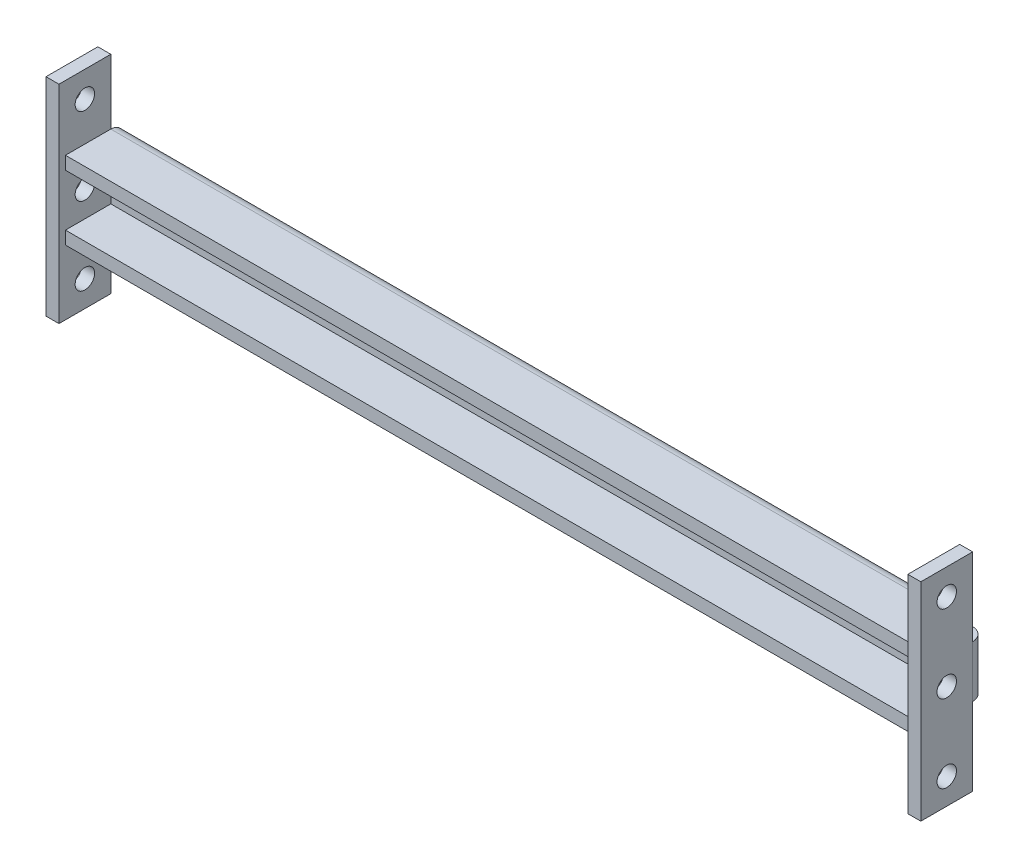
ISO-10303-21;
HEADER;
FILE_DESCRIPTION(('STEP AP214'),'2;1');
FILE_NAME('part.step','',(''),(''),'','','');
FILE_SCHEMA(('AUTOMOTIVE_DESIGN { 1 0 10303 214 1 1 1 1 }'));
ENDSEC;
DATA;
#1=APPLICATION_CONTEXT('core data for automotive mechanical design processes');
#2=APPLICATION_PROTOCOL_DEFINITION('international standard','automotive_design',2000,#1);
#3=PRODUCT_CONTEXT('',#1,'mechanical');
#4=PRODUCT('Part','Part','',(#3));
#5=PRODUCT_RELATED_PRODUCT_CATEGORY('part','',(#4));
#6=PRODUCT_DEFINITION_FORMATION('','',#4);
#7=PRODUCT_DEFINITION_CONTEXT('part definition',#1,'design');
#8=PRODUCT_DEFINITION('design','',#6,#7);
#9=PRODUCT_DEFINITION_SHAPE('','',#8);
#10=(LENGTH_UNIT() NAMED_UNIT(*) SI_UNIT(.MILLI.,.METRE.));
#11=(NAMED_UNIT(*) PLANE_ANGLE_UNIT() SI_UNIT($,.RADIAN.));
#12=(NAMED_UNIT(*) SI_UNIT($,.STERADIAN.) SOLID_ANGLE_UNIT());
#13=UNCERTAINTY_MEASURE_WITH_UNIT(LENGTH_MEASURE(1.E-05),#10,'distance_accuracy_value','');
#14=(GEOMETRIC_REPRESENTATION_CONTEXT(3) GLOBAL_UNCERTAINTY_ASSIGNED_CONTEXT((#13)) GLOBAL_UNIT_ASSIGNED_CONTEXT((#10,
#11,#12)) REPRESENTATION_CONTEXT('',''));
#15=CARTESIAN_POINT('',(0.,0.,0.));
#16=DIRECTION('',(0.,0.,1.));
#17=DIRECTION('',(1.,0.,0.));
#18=AXIS2_PLACEMENT_3D('',#15,#16,#17);
#19=CARTESIAN_POINT('',(59.5,3.,9.));
#20=DIRECTION('',(1.,0.,0.));
#21=DIRECTION('',(0.,1.,0.));
#22=AXIS2_PLACEMENT_3D('',#19,#20,#21);
#23=PLANE('',#22);
#24=DIRECTION('',(0.,0.,-1.));
#25=VECTOR('',#24,1.);
#26=CARTESIAN_POINT('',(59.5,3.,9.));
#27=LINE('',#26,#25);
#28=CARTESIAN_POINT('',(59.5,3.,9.));
#29=VERTEX_POINT('',#28);
#30=CARTESIAN_POINT('',(59.5,3.,2.));
#31=VERTEX_POINT('',#30);
#32=EDGE_CURVE('E103',#29,#31,#27,.T.);
#33=ORIENTED_EDGE('',*,*,#32,.T.);
#34=CARTESIAN_POINT('',(59.5,5.,2.));
#35=DIRECTION('',(1.,0.,0.));
#36=DIRECTION('',(0.,1.,0.));
#37=AXIS2_PLACEMENT_3D('',#34,#35,#36);
#38=CIRCLE('',#37,2.);
#39=CARTESIAN_POINT('',(59.5,5.00000000000001,0.));
#40=VERTEX_POINT('',#39);
#41=EDGE_CURVE('E12',#31,#40,#38,.T.);
#42=ORIENTED_EDGE('',*,*,#41,.T.);
#43=DIRECTION('',(0.,0.,-1.));
#44=VECTOR('',#43,1.);
#45=CARTESIAN_POINT('',(59.5,5.00000000000001,9.));
#46=LINE('',#45,#44);
#47=CARTESIAN_POINT('',(59.5,5.00000000000001,9.));
#48=VERTEX_POINT('',#47);
#49=EDGE_CURVE('E101',#48,#40,#46,.T.);
#50=ORIENTED_EDGE('',*,*,#49,.F.);
#51=DIRECTION('',(0.,-1.,0.));
#52=VECTOR('',#51,1.);
#53=CARTESIAN_POINT('',(59.5,3.,9.));
#54=LINE('',#53,#52);
#55=EDGE_CURVE('E117',#48,#29,#54,.T.);
#56=ORIENTED_EDGE('',*,*,#55,.T.);
#57=EDGE_LOOP('',(#33,#42,#50,#56));
#58=FACE_BOUND('',#57,.T.);
#59=ADVANCED_FACE('F60',(#58),#23,.T.);
#60=CARTESIAN_POINT('',(59.5,5.00000000000001,9.));
#61=DIRECTION('',(0.,1.,0.));
#62=DIRECTION('',(-1.,0.,0.));
#63=AXIS2_PLACEMENT_3D('',#60,#61,#62);
#64=PLANE('',#63);
#65=DIRECTION('',(1.,0.,0.));
#66=VECTOR('',#65,1.);
#67=CARTESIAN_POINT('',(59.5,5.00000000000001,0.));
#68=LINE('',#67,#66);
#69=CARTESIAN_POINT('',(-71.5,5.,0.));
#70=VERTEX_POINT('',#69);
#71=EDGE_CURVE('E110',#70,#40,#68,.T.);
#72=ORIENTED_EDGE('',*,*,#71,.F.);
#73=DIRECTION('',(0.,0.,-1.));
#74=VECTOR('',#73,1.);
#75=CARTESIAN_POINT('',(-71.5,5.,9.));
#76=LINE('',#75,#74);
#77=CARTESIAN_POINT('',(-71.5,5.,9.));
#78=VERTEX_POINT('',#77);
#79=EDGE_CURVE('E114',#78,#70,#76,.T.);
#80=ORIENTED_EDGE('',*,*,#79,.F.);
#81=DIRECTION('',(1.,0.,0.));
#82=VECTOR('',#81,1.);
#83=CARTESIAN_POINT('',(59.5,5.00000000000001,9.));
#84=LINE('',#83,#82);
#85=EDGE_CURVE('E112',#78,#48,#84,.T.);
#86=ORIENTED_EDGE('',*,*,#85,.T.);
#87=ORIENTED_EDGE('',*,*,#49,.T.);
#88=EDGE_LOOP('',(#72,#80,#86,#87));
#89=FACE_BOUND('',#88,.T.);
#90=ADVANCED_FACE('F109',(#89),#64,.T.);
#91=CARTESIAN_POINT('',(-71.5,5.,9.));
#92=DIRECTION('',(-1.,0.,0.));
#93=DIRECTION('',(0.,0.,1.));
#94=AXIS2_PLACEMENT_3D('',#91,#92,#93);
#95=PLANE('',#94);
#96=ORIENTED_EDGE('',*,*,#79,.T.);
#97=CARTESIAN_POINT('',(-71.5,5.,2.));
#98=DIRECTION('',(-1.,0.,0.));
#99=DIRECTION('',(0.,0.,1.));
#100=AXIS2_PLACEMENT_3D('',#97,#98,#99);
#101=CIRCLE('',#100,2.);
#102=CARTESIAN_POINT('',(-71.5,3.,2.));
#103=VERTEX_POINT('',#102);
#104=EDGE_CURVE('E83',#70,#103,#101,.T.);
#105=ORIENTED_EDGE('',*,*,#104,.T.);
#106=DIRECTION('',(0.,0.,-1.));
#107=VECTOR('',#106,1.);
#108=CARTESIAN_POINT('',(-71.5,3.,9.));
#109=LINE('',#108,#107);
#110=CARTESIAN_POINT('',(-71.5,3.,9.));
#111=VERTEX_POINT('',#110);
#112=EDGE_CURVE('E136',#111,#103,#109,.T.);
#113=ORIENTED_EDGE('',*,*,#112,.F.);
#114=DIRECTION('',(0.,1.,0.));
#115=VECTOR('',#114,1.);
#116=CARTESIAN_POINT('',(-71.5,5.,9.));
#117=LINE('',#116,#115);
#118=EDGE_CURVE('E129',#111,#78,#117,.T.);
#119=ORIENTED_EDGE('',*,*,#118,.T.);
#120=EDGE_LOOP('',(#96,#105,#113,#119));
#121=FACE_BOUND('',#120,.T.);
#122=ADVANCED_FACE('F141',(#121),#95,.T.);
#123=CARTESIAN_POINT('',(-71.5,3.,9.));
#124=DIRECTION('',(0.,-1.,0.));
#125=DIRECTION('',(0.,0.,-1.));
#126=AXIS2_PLACEMENT_3D('',#123,#124,#125);
#127=PLANE('',#126);
#128=ORIENTED_EDGE('',*,*,#112,.T.);
#129=DIRECTION('',(-1.,0.,0.));
#130=VECTOR('',#129,1.);
#131=CARTESIAN_POINT('',(59.5,3.,2.));
#132=LINE('',#131,#130);
#133=EDGE_CURVE('E69',#103,#31,#132,.F.);
#134=ORIENTED_EDGE('',*,*,#133,.T.);
#135=ORIENTED_EDGE('',*,*,#32,.F.);
#136=DIRECTION('',(-1.,0.,0.));
#137=VECTOR('',#136,1.);
#138=CARTESIAN_POINT('',(-71.5,3.,9.));
#139=LINE('',#138,#137);
#140=EDGE_CURVE('E123',#29,#111,#139,.T.);
#141=ORIENTED_EDGE('',*,*,#140,.T.);
#142=EDGE_LOOP('',(#128,#134,#135,#141));
#143=FACE_BOUND('',#142,.T.);
#144=ADVANCED_FACE('F146',(#143),#127,.T.);
#145=CARTESIAN_POINT('',(0.,0.,9.));
#146=DIRECTION('',(0.,0.,1.));
#147=DIRECTION('',(1.,0.,0.));
#148=AXIS2_PLACEMENT_3D('',#145,#146,#147);
#149=PLANE('',#148);
#150=ORIENTED_EDGE('',*,*,#55,.F.);
#151=ORIENTED_EDGE('',*,*,#85,.F.);
#152=ORIENTED_EDGE('',*,*,#118,.F.);
#153=ORIENTED_EDGE('',*,*,#140,.F.);
#154=EDGE_LOOP('',(#150,#151,#152,#153));
#155=FACE_BOUND('',#154,.T.);
#156=ADVANCED_FACE('F145',(#155),#149,.T.);
#157=CARTESIAN_POINT('',(0.,5.,2.));
#158=DIRECTION('',(1.,0.,0.));
#159=DIRECTION('',(0.,0.,-1.));
#160=AXIS2_PLACEMENT_3D('',#157,#158,#159);
#161=CYLINDRICAL_SURFACE('',#160,2.);
#162=ORIENTED_EDGE('',*,*,#41,.F.);
#163=ORIENTED_EDGE('',*,*,#133,.F.);
#164=ORIENTED_EDGE('',*,*,#104,.F.);
#165=ORIENTED_EDGE('',*,*,#71,.T.);
#166=EDGE_LOOP('',(#162,#163,#164,#165));
#167=FACE_BOUND('',#166,.T.);
#168=ADVANCED_FACE('F62',(#167),#161,.T.);
#169=CLOSED_SHELL('',(#59,#90,#122,#144,#156,#168));
#170=MANIFOLD_SOLID_BREP('B2',#169);
#171=CARTESIAN_POINT('',(59.5,15.,9.));
#172=DIRECTION('',(1.,0.,0.));
#173=DIRECTION('',(0.,1.,0.));
#174=AXIS2_PLACEMENT_3D('',#171,#172,#173);
#175=PLANE('',#174);
#176=DIRECTION('',(0.,0.,-1.));
#177=VECTOR('',#176,1.);
#178=CARTESIAN_POINT('',(59.5,13.,9.));
#179=LINE('',#178,#177);
#180=CARTESIAN_POINT('',(59.5,13.,9.));
#181=VERTEX_POINT('',#180);
#182=CARTESIAN_POINT('',(59.5,13.,0.));
#183=VERTEX_POINT('',#182);
#184=EDGE_CURVE('E251',#181,#183,#179,.T.);
#185=ORIENTED_EDGE('',*,*,#184,.T.);
#186=CARTESIAN_POINT('',(59.5,13.,2.));
#187=DIRECTION('',(1.,0.,0.));
#188=DIRECTION('',(0.,1.,0.));
#189=AXIS2_PLACEMENT_3D('',#186,#187,#188);
#190=CIRCLE('',#189,2.);
#191=CARTESIAN_POINT('',(59.5,15.,2.));
#192=VERTEX_POINT('',#191);
#193=EDGE_CURVE('E234',#183,#192,#190,.T.);
#194=ORIENTED_EDGE('',*,*,#193,.T.);
#195=DIRECTION('',(0.,0.,-1.));
#196=VECTOR('',#195,1.);
#197=CARTESIAN_POINT('',(59.5,15.,9.));
#198=LINE('',#197,#196);
#199=CARTESIAN_POINT('',(59.5,15.,9.));
#200=VERTEX_POINT('',#199);
#201=EDGE_CURVE('E274',#200,#192,#198,.T.);
#202=ORIENTED_EDGE('',*,*,#201,.F.);
#203=DIRECTION('',(0.,-1.,0.));
#204=VECTOR('',#203,1.);
#205=CARTESIAN_POINT('',(59.5,15.,9.));
#206=LINE('',#205,#204);
#207=EDGE_CURVE('E268',#200,#181,#206,.T.);
#208=ORIENTED_EDGE('',*,*,#207,.T.);
#209=EDGE_LOOP('',(#185,#194,#202,#208));
#210=FACE_BOUND('',#209,.T.);
#211=ADVANCED_FACE('F211',(#210),#175,.T.);
#212=CARTESIAN_POINT('',(-71.5,15.,9.));
#213=DIRECTION('',(0.,1.,0.));
#214=DIRECTION('',(-1.,0.,0.));
#215=AXIS2_PLACEMENT_3D('',#212,#213,#214);
#216=PLANE('',#215);
#217=ORIENTED_EDGE('',*,*,#201,.T.);
#218=DIRECTION('',(1.,0.,0.));
#219=VECTOR('',#218,1.);
#220=CARTESIAN_POINT('',(-71.5,15.,2.));
#221=LINE('',#220,#219);
#222=CARTESIAN_POINT('',(-71.5,15.,2.));
#223=VERTEX_POINT('',#222);
#224=EDGE_CURVE('E220',#192,#223,#221,.F.);
#225=ORIENTED_EDGE('',*,*,#224,.T.);
#226=DIRECTION('',(0.,0.,-1.));
#227=VECTOR('',#226,1.);
#228=CARTESIAN_POINT('',(-71.5,15.,9.));
#229=LINE('',#228,#227);
#230=CARTESIAN_POINT('',(-71.5,15.,9.));
#231=VERTEX_POINT('',#230);
#232=EDGE_CURVE('E288',#231,#223,#229,.T.);
#233=ORIENTED_EDGE('',*,*,#232,.F.);
#234=DIRECTION('',(1.,0.,0.));
#235=VECTOR('',#234,1.);
#236=CARTESIAN_POINT('',(-71.5,15.,9.));
#237=LINE('',#236,#235);
#238=EDGE_CURVE('E261',#231,#200,#237,.T.);
#239=ORIENTED_EDGE('',*,*,#238,.T.);
#240=EDGE_LOOP('',(#217,#225,#233,#239));
#241=FACE_BOUND('',#240,.T.);
#242=ADVANCED_FACE('F297',(#241),#216,.T.);
#243=CARTESIAN_POINT('',(-71.5,13.,9.));
#244=DIRECTION('',(-1.,0.,0.));
#245=DIRECTION('',(0.,0.,1.));
#246=AXIS2_PLACEMENT_3D('',#243,#244,#245);
#247=PLANE('',#246);
#248=ORIENTED_EDGE('',*,*,#232,.T.);
#249=CARTESIAN_POINT('',(-71.5,13.,2.));
#250=DIRECTION('',(-1.,0.,0.));
#251=DIRECTION('',(0.,0.,1.));
#252=AXIS2_PLACEMENT_3D('',#249,#250,#251);
#253=CIRCLE('',#252,2.);
#254=CARTESIAN_POINT('',(-71.5,13.,0.));
#255=VERTEX_POINT('',#254);
#256=EDGE_CURVE('E58',#223,#255,#253,.T.);
#257=ORIENTED_EDGE('',*,*,#256,.T.);
#258=DIRECTION('',(0.,0.,-1.));
#259=VECTOR('',#258,1.);
#260=CARTESIAN_POINT('',(-71.5,13.,9.));
#261=LINE('',#260,#259);
#262=CARTESIAN_POINT('',(-71.5,13.,9.));
#263=VERTEX_POINT('',#262);
#264=EDGE_CURVE('E260',#263,#255,#261,.T.);
#265=ORIENTED_EDGE('',*,*,#264,.F.);
#266=DIRECTION('',(0.,1.,0.));
#267=VECTOR('',#266,1.);
#268=CARTESIAN_POINT('',(-71.5,13.,9.));
#269=LINE('',#268,#267);
#270=EDGE_CURVE('E271',#263,#231,#269,.T.);
#271=ORIENTED_EDGE('',*,*,#270,.T.);
#272=EDGE_LOOP('',(#248,#257,#265,#271));
#273=FACE_BOUND('',#272,.T.);
#274=ADVANCED_FACE('F296',(#273),#247,.T.);
#275=CARTESIAN_POINT('',(59.5,13.,9.));
#276=DIRECTION('',(0.,-1.,0.));
#277=DIRECTION('',(0.,0.,-1.));
#278=AXIS2_PLACEMENT_3D('',#275,#276,#277);
#279=PLANE('',#278);
#280=DIRECTION('',(-1.,0.,0.));
#281=VECTOR('',#280,1.);
#282=CARTESIAN_POINT('',(59.5,13.,0.));
#283=LINE('',#282,#281);
#284=EDGE_CURVE('E257',#183,#255,#283,.T.);
#285=ORIENTED_EDGE('',*,*,#284,.F.);
#286=ORIENTED_EDGE('',*,*,#184,.F.);
#287=DIRECTION('',(-1.,0.,0.));
#288=VECTOR('',#287,1.);
#289=CARTESIAN_POINT('',(59.5,13.,9.));
#290=LINE('',#289,#288);
#291=EDGE_CURVE('E255',#181,#263,#290,.T.);
#292=ORIENTED_EDGE('',*,*,#291,.T.);
#293=ORIENTED_EDGE('',*,*,#264,.T.);
#294=EDGE_LOOP('',(#285,#286,#292,#293));
#295=FACE_BOUND('',#294,.T.);
#296=ADVANCED_FACE('F253',(#295),#279,.T.);
#297=CARTESIAN_POINT('',(0.,0.,9.));
#298=DIRECTION('',(0.,0.,-1.));
#299=DIRECTION('',(-1.,0.,0.));
#300=AXIS2_PLACEMENT_3D('',#297,#298,#299);
#301=PLANE('',#300);
#302=ORIENTED_EDGE('',*,*,#207,.F.);
#303=ORIENTED_EDGE('',*,*,#238,.F.);
#304=ORIENTED_EDGE('',*,*,#270,.F.);
#305=ORIENTED_EDGE('',*,*,#291,.F.);
#306=EDGE_LOOP('',(#302,#303,#304,#305));
#307=FACE_BOUND('',#306,.T.);
#308=ADVANCED_FACE('F266',(#307),#301,.F.);
#309=CARTESIAN_POINT('',(0.,13.,2.));
#310=DIRECTION('',(1.,0.,0.));
#311=DIRECTION('',(0.,1.,0.));
#312=AXIS2_PLACEMENT_3D('',#309,#310,#311);
#313=CYLINDRICAL_SURFACE('',#312,2.);
#314=ORIENTED_EDGE('',*,*,#256,.F.);
#315=ORIENTED_EDGE('',*,*,#224,.F.);
#316=ORIENTED_EDGE('',*,*,#193,.F.);
#317=ORIENTED_EDGE('',*,*,#284,.T.);
#318=EDGE_LOOP('',(#314,#315,#316,#317));
#319=FACE_BOUND('',#318,.T.);
#320=ADVANCED_FACE('F213',(#319),#313,.T.);
#321=CLOSED_SHELL('',(#211,#242,#274,#296,#308,#320));
#322=MANIFOLD_SOLID_BREP('B6',#321);
#323=CARTESIAN_POINT('',(61.5,13.,2.));
#324=DIRECTION('',(-1.,0.,0.));
#325=DIRECTION('',(0.,0.,1.));
#326=AXIS2_PLACEMENT_3D('',#323,#324,#325);
#327=PLANE('',#326);
#328=CARTESIAN_POINT('',(61.5,-3.,6.));
#329=DIRECTION('',(1.,0.,0.));
#330=DIRECTION('',(0.,0.,-1.));
#331=AXIS2_PLACEMENT_3D('',#328,#329,#330);
#332=CIRCLE('',#331,1.5);
#333=CARTESIAN_POINT('',(61.5,-3.,4.5));
#334=VERTEX_POINT('',#333);
#335=EDGE_CURVE('E761',#334,#334,#332,.T.);
#336=ORIENTED_EDGE('',*,*,#335,.F.);
#337=EDGE_LOOP('',(#336));
#338=FACE_BOUND('',#337,.T.);
#339=CARTESIAN_POINT('',(61.5,21.,6.));
#340=DIRECTION('',(1.,0.,0.));
#341=DIRECTION('',(0.,0.,-1.));
#342=AXIS2_PLACEMENT_3D('',#339,#340,#341);
#343=CIRCLE('',#342,1.5);
#344=CARTESIAN_POINT('',(61.5,21.,4.5));
#345=VERTEX_POINT('',#344);
#346=EDGE_CURVE('E757',#345,#345,#343,.T.);
#347=ORIENTED_EDGE('',*,*,#346,.F.);
#348=EDGE_LOOP('',(#347));
#349=FACE_BOUND('',#348,.T.);
#350=CARTESIAN_POINT('',(61.5,9.,6.));
#351=DIRECTION('',(1.,0.,0.));
#352=DIRECTION('',(0.,0.,-1.));
#353=AXIS2_PLACEMENT_3D('',#350,#351,#352);
#354=CIRCLE('',#353,1.5);
#355=CARTESIAN_POINT('',(61.5,9.,4.5));
#356=VERTEX_POINT('',#355);
#357=EDGE_CURVE('E607',#356,#356,#354,.T.);
#358=ORIENTED_EDGE('',*,*,#357,.F.);
#359=EDGE_LOOP('',(#358));
#360=FACE_BOUND('',#359,.T.);
#361=DIRECTION('',(0.,1.,0.));
#362=VECTOR('',#361,1.);
#363=CARTESIAN_POINT('',(61.5,13.,2.));
#364=LINE('',#363,#362);
#365=CARTESIAN_POINT('',(61.5,-7.,2.));
#366=VERTEX_POINT('',#365);
#367=CARTESIAN_POINT('',(61.5,5.,2.));
#368=VERTEX_POINT('',#367);
#369=EDGE_CURVE('E529',#366,#368,#364,.T.);
#370=ORIENTED_EDGE('',*,*,#369,.T.);
#371=DIRECTION('',(0.,1.,0.));
#372=VECTOR('',#371,1.);
#373=CARTESIAN_POINT('',(61.5,13.,2.));
#374=LINE('',#373,#372);
#375=CARTESIAN_POINT('',(61.5,13.,2.));
#376=VERTEX_POINT('',#375);
#377=EDGE_CURVE('E209',#368,#376,#374,.T.);
#378=ORIENTED_EDGE('',*,*,#377,.T.);
#379=CARTESIAN_POINT('',(61.5,25.,2.));
#380=VERTEX_POINT('',#379);
#381=EDGE_CURVE('E528',#376,#380,#364,.T.);
#382=ORIENTED_EDGE('',*,*,#381,.T.);
#383=DIRECTION('',(0.,0.,-1.));
#384=VECTOR('',#383,1.);
#385=CARTESIAN_POINT('',(61.5,25.,10.));
#386=LINE('',#385,#384);
#387=CARTESIAN_POINT('',(61.5,25.,10.));
#388=VERTEX_POINT('',#387);
#389=EDGE_CURVE('E505',#388,#380,#386,.T.);
#390=ORIENTED_EDGE('',*,*,#389,.F.);
#391=DIRECTION('',(0.,1.,0.));
#392=VECTOR('',#391,1.);
#393=CARTESIAN_POINT('',(61.5,-7.,10.));
#394=LINE('',#393,#392);
#395=CARTESIAN_POINT('',(61.5,-7.,10.));
#396=VERTEX_POINT('',#395);
#397=EDGE_CURVE('E543',#396,#388,#394,.T.);
#398=ORIENTED_EDGE('',*,*,#397,.F.);
#399=DIRECTION('',(0.,0.,-1.));
#400=VECTOR('',#399,1.);
#401=CARTESIAN_POINT('',(61.5,-7.,10.));
#402=LINE('',#401,#400);
#403=EDGE_CURVE('E501',#396,#366,#402,.T.);
#404=ORIENTED_EDGE('',*,*,#403,.T.);
#405=EDGE_LOOP('',(#370,#378,#382,#390,#398,#404));
#406=FACE_BOUND('',#405,.T.);
#407=ADVANCED_FACE('F353',(#338,#349,#360,#406),#327,.F.);
#408=CARTESIAN_POINT('',(-73.5,13.,2.));
#409=DIRECTION('',(0.,-1.,0.));
#410=DIRECTION('',(0.,0.,-1.));
#411=AXIS2_PLACEMENT_3D('',#408,#409,#410);
#412=PLANE('',#411);
#413=DIRECTION('',(-1.,0.,0.));
#414=VECTOR('',#413,1.);
#415=CARTESIAN_POINT('',(-73.5,13.,0.));
#416=LINE('',#415,#414);
#417=CARTESIAN_POINT('',(59.5,13.,0.));
#418=VERTEX_POINT('',#417);
#419=CARTESIAN_POINT('',(-71.5,13.,0.));
#420=VERTEX_POINT('',#419);
#421=EDGE_CURVE('E488',#418,#420,#416,.T.);
#422=ORIENTED_EDGE('',*,*,#421,.T.);
#423=CARTESIAN_POINT('',(-71.5,13.,2.));
#424=DIRECTION('',(0.,-1.,0.));
#425=DIRECTION('',(0.,0.,-1.));
#426=AXIS2_PLACEMENT_3D('',#423,#424,#425);
#427=CIRCLE('',#426,2.);
#428=CARTESIAN_POINT('',(-73.5,13.,2.));
#429=VERTEX_POINT('',#428);
#430=EDGE_CURVE('E363',#420,#429,#427,.F.);
#431=ORIENTED_EDGE('',*,*,#430,.T.);
#432=DIRECTION('',(-1.,0.,0.));
#433=VECTOR('',#432,1.);
#434=CARTESIAN_POINT('',(-73.5,13.,2.));
#435=LINE('',#434,#433);
#436=CARTESIAN_POINT('',(-71.5,13.,2.));
#437=VERTEX_POINT('',#436);
#438=EDGE_CURVE('E556',#437,#429,#435,.T.);
#439=ORIENTED_EDGE('',*,*,#438,.F.);
#440=CARTESIAN_POINT('',(59.5,13.,2.));
#441=VERTEX_POINT('',#440);
#442=EDGE_CURVE('E555',#441,#437,#435,.T.);
#443=ORIENTED_EDGE('',*,*,#442,.F.);
#444=EDGE_CURVE('E550',#376,#441,#435,.T.);
#445=ORIENTED_EDGE('',*,*,#444,.F.);
#446=CARTESIAN_POINT('',(59.5,13.,2.));
#447=DIRECTION('',(0.,-1.,0.));
#448=DIRECTION('',(0.,0.,-1.));
#449=AXIS2_PLACEMENT_3D('',#446,#447,#448);
#450=CIRCLE('',#449,2.);
#451=EDGE_CURVE('E378',#376,#418,#450,.F.);
#452=ORIENTED_EDGE('',*,*,#451,.T.);
#453=EDGE_LOOP('',(#422,#431,#439,#443,#445,#452));
#454=FACE_BOUND('',#453,.T.);
#455=ADVANCED_FACE('F699',(#454),#412,.F.);
#456=CARTESIAN_POINT('',(-73.5,5.,2.));
#457=DIRECTION('',(1.,0.,0.));
#458=DIRECTION('',(0.,0.,-1.));
#459=AXIS2_PLACEMENT_3D('',#456,#457,#458);
#460=PLANE('',#459);
#461=CARTESIAN_POINT('',(-73.5,-3.,6.));
#462=DIRECTION('',(1.,0.,0.));
#463=DIRECTION('',(0.,0.,-1.));
#464=AXIS2_PLACEMENT_3D('',#461,#462,#463);
#465=CIRCLE('',#464,1.5);
#466=CARTESIAN_POINT('',(-73.5,-3.,4.5));
#467=VERTEX_POINT('',#466);
#468=EDGE_CURVE('E746',#467,#467,#465,.T.);
#469=ORIENTED_EDGE('',*,*,#468,.T.);
#470=EDGE_LOOP('',(#469));
#471=FACE_BOUND('',#470,.T.);
#472=CARTESIAN_POINT('',(-73.5,21.,6.));
#473=DIRECTION('',(1.,0.,0.));
#474=DIRECTION('',(0.,0.,-1.));
#475=AXIS2_PLACEMENT_3D('',#472,#473,#474);
#476=CIRCLE('',#475,1.5);
#477=CARTESIAN_POINT('',(-73.5,21.,4.5));
#478=VERTEX_POINT('',#477);
#479=EDGE_CURVE('E750',#478,#478,#476,.T.);
#480=ORIENTED_EDGE('',*,*,#479,.T.);
#481=EDGE_LOOP('',(#480));
#482=FACE_BOUND('',#481,.T.);
#483=CARTESIAN_POINT('',(-73.5,9.,6.));
#484=DIRECTION('',(1.,0.,0.));
#485=DIRECTION('',(0.,0.,-1.));
#486=AXIS2_PLACEMENT_3D('',#483,#484,#485);
#487=CIRCLE('',#486,1.5);
#488=CARTESIAN_POINT('',(-73.5,9.,4.5));
#489=VERTEX_POINT('',#488);
#490=EDGE_CURVE('E588',#489,#489,#487,.T.);
#491=ORIENTED_EDGE('',*,*,#490,.T.);
#492=EDGE_LOOP('',(#491));
#493=FACE_BOUND('',#492,.T.);
#494=DIRECTION('',(0.,-1.,0.));
#495=VECTOR('',#494,1.);
#496=CARTESIAN_POINT('',(-73.5,13.,2.));
#497=LINE('',#496,#495);
#498=CARTESIAN_POINT('',(-73.5,25.,2.));
#499=VERTEX_POINT('',#498);
#500=EDGE_CURVE('E479',#499,#429,#497,.T.);
#501=ORIENTED_EDGE('',*,*,#500,.T.);
#502=DIRECTION('',(0.,-1.,0.));
#503=VECTOR('',#502,1.);
#504=CARTESIAN_POINT('',(-73.5,5.,2.));
#505=LINE('',#504,#503);
#506=CARTESIAN_POINT('',(-73.5,5.,2.));
#507=VERTEX_POINT('',#506);
#508=EDGE_CURVE('E565',#429,#507,#505,.T.);
#509=ORIENTED_EDGE('',*,*,#508,.T.);
#510=CARTESIAN_POINT('',(-73.5,-7.,2.));
#511=VERTEX_POINT('',#510);
#512=EDGE_CURVE('E485',#507,#511,#497,.T.);
#513=ORIENTED_EDGE('',*,*,#512,.T.);
#514=DIRECTION('',(0.,0.,-1.));
#515=VECTOR('',#514,1.);
#516=CARTESIAN_POINT('',(-73.5,-7.,10.));
#517=LINE('',#516,#515);
#518=CARTESIAN_POINT('',(-73.5,-7.,10.));
#519=VERTEX_POINT('',#518);
#520=EDGE_CURVE('E462',#519,#511,#517,.T.);
#521=ORIENTED_EDGE('',*,*,#520,.F.);
#522=DIRECTION('',(0.,-1.,0.));
#523=VECTOR('',#522,1.);
#524=CARTESIAN_POINT('',(-73.5,-7.,10.));
#525=LINE('',#524,#523);
#526=CARTESIAN_POINT('',(-73.5,25.,10.));
#527=VERTEX_POINT('',#526);
#528=EDGE_CURVE('E469',#527,#519,#525,.T.);
#529=ORIENTED_EDGE('',*,*,#528,.F.);
#530=DIRECTION('',(0.,0.,-1.));
#531=VECTOR('',#530,1.);
#532=CARTESIAN_POINT('',(-73.5,25.,10.));
#533=LINE('',#532,#531);
#534=EDGE_CURVE('E617',#527,#499,#533,.T.);
#535=ORIENTED_EDGE('',*,*,#534,.T.);
#536=EDGE_LOOP('',(#501,#509,#513,#521,#529,#535));
#537=FACE_BOUND('',#536,.T.);
#538=ADVANCED_FACE('F482',(#471,#482,#493,#537),#460,.F.);
#539=CARTESIAN_POINT('',(-73.5,5.,2.));
#540=DIRECTION('',(0.,1.,0.));
#541=DIRECTION('',(0.,0.,1.));
#542=AXIS2_PLACEMENT_3D('',#539,#540,#541);
#543=PLANE('',#542);
#544=DIRECTION('',(1.,0.,0.));
#545=VECTOR('',#544,1.);
#546=CARTESIAN_POINT('',(-73.5,5.,2.));
#547=LINE('',#546,#545);
#548=CARTESIAN_POINT('',(-71.5,5.,2.));
#549=VERTEX_POINT('',#548);
#550=EDGE_CURVE('E557',#507,#549,#547,.T.);
#551=ORIENTED_EDGE('',*,*,#550,.F.);
#552=CARTESIAN_POINT('',(-71.5,5.,2.));
#553=DIRECTION('',(0.,1.,0.));
#554=DIRECTION('',(0.,0.,1.));
#555=AXIS2_PLACEMENT_3D('',#552,#553,#554);
#556=CIRCLE('',#555,2.);
#557=CARTESIAN_POINT('',(-71.5,5.,0.));
#558=VERTEX_POINT('',#557);
#559=EDGE_CURVE('E572',#507,#558,#556,.F.);
#560=ORIENTED_EDGE('',*,*,#559,.T.);
#561=DIRECTION('',(1.,0.,0.));
#562=VECTOR('',#561,1.);
#563=CARTESIAN_POINT('',(-73.5,5.,0.));
#564=LINE('',#563,#562);
#565=CARTESIAN_POINT('',(59.5,5.,0.));
#566=VERTEX_POINT('',#565);
#567=EDGE_CURVE('E494',#558,#566,#564,.T.);
#568=ORIENTED_EDGE('',*,*,#567,.T.);
#569=CARTESIAN_POINT('',(59.5,5.,2.));
#570=DIRECTION('',(0.,1.,0.));
#571=DIRECTION('',(0.,0.,1.));
#572=AXIS2_PLACEMENT_3D('',#569,#570,#571);
#573=CIRCLE('',#572,2.);
#574=EDGE_CURVE('E568',#566,#368,#573,.F.);
#575=ORIENTED_EDGE('',*,*,#574,.T.);
#576=CARTESIAN_POINT('',(59.5,5.,2.));
#577=VERTEX_POINT('',#576);
#578=EDGE_CURVE('E554',#577,#368,#547,.T.);
#579=ORIENTED_EDGE('',*,*,#578,.F.);
#580=EDGE_CURVE('E560',#549,#577,#547,.T.);
#581=ORIENTED_EDGE('',*,*,#580,.F.);
#582=EDGE_LOOP('',(#551,#560,#568,#575,#579,#581));
#583=FACE_BOUND('',#582,.T.);
#584=ADVANCED_FACE('F651',(#583),#543,.F.);
#585=CARTESIAN_POINT('',(0.,0.,2.));
#586=DIRECTION('',(0.,0.,1.));
#587=DIRECTION('',(1.,0.,0.));
#588=AXIS2_PLACEMENT_3D('',#585,#586,#587);
#589=PLANE('',#588);
#590=DIRECTION('',(0.,1.,0.));
#591=VECTOR('',#590,1.);
#592=CARTESIAN_POINT('',(-71.5,25.,2.));
#593=LINE('',#592,#591);
#594=EDGE_CURVE('E569',#549,#437,#593,.T.);
#595=ORIENTED_EDGE('',*,*,#594,.F.);
#596=ORIENTED_EDGE('',*,*,#580,.T.);
#597=DIRECTION('',(0.,-1.,0.));
#598=VECTOR('',#597,1.);
#599=CARTESIAN_POINT('',(59.5,25.,2.));
#600=LINE('',#599,#598);
#601=EDGE_CURVE('E525',#441,#577,#600,.T.);
#602=ORIENTED_EDGE('',*,*,#601,.F.);
#603=ORIENTED_EDGE('',*,*,#442,.T.);
#604=EDGE_LOOP('',(#595,#596,#602,#603));
#605=FACE_BOUND('',#604,.T.);
#606=ADVANCED_FACE('F733',(#605),#589,.T.);
#607=CARTESIAN_POINT('',(0.,0.,0.));
#608=DIRECTION('',(0.,0.,1.));
#609=DIRECTION('',(1.,0.,0.));
#610=AXIS2_PLACEMENT_3D('',#607,#608,#609);
#611=PLANE('',#610);
#612=ORIENTED_EDGE('',*,*,#567,.F.);
#613=DIRECTION('',(0.,-1.,0.));
#614=VECTOR('',#613,1.);
#615=CARTESIAN_POINT('',(-71.5,0.,0.));
#616=LINE('',#615,#614);
#617=EDGE_CURVE('E371',#558,#420,#616,.F.);
#618=ORIENTED_EDGE('',*,*,#617,.T.);
#619=ORIENTED_EDGE('',*,*,#421,.F.);
#620=DIRECTION('',(0.,1.,0.));
#621=VECTOR('',#620,1.);
#622=CARTESIAN_POINT('',(59.5,0.,0.));
#623=LINE('',#622,#621);
#624=EDGE_CURVE('E575',#418,#566,#623,.F.);
#625=ORIENTED_EDGE('',*,*,#624,.T.);
#626=EDGE_LOOP('',(#612,#618,#619,#625));
#627=FACE_BOUND('',#626,.T.);
#628=ADVANCED_FACE('F654',(#627),#611,.F.);
#629=CARTESIAN_POINT('',(0.,0.,2.));
#630=DIRECTION('',(0.,0.,1.));
#631=DIRECTION('',(1.,0.,0.));
#632=AXIS2_PLACEMENT_3D('',#629,#630,#631);
#633=PLANE('',#632);
#634=ORIENTED_EDGE('',*,*,#381,.F.);
#635=ORIENTED_EDGE('',*,*,#444,.T.);
#636=CARTESIAN_POINT('',(59.5,25.,2.));
#637=VERTEX_POINT('',#636);
#638=EDGE_CURVE('E519',#637,#441,#600,.T.);
#639=ORIENTED_EDGE('',*,*,#638,.F.);
#640=DIRECTION('',(-1.,0.,0.));
#641=VECTOR('',#640,1.);
#642=CARTESIAN_POINT('',(61.5,25.,2.));
#643=LINE('',#642,#641);
#644=EDGE_CURVE('E523',#380,#637,#643,.T.);
#645=ORIENTED_EDGE('',*,*,#644,.F.);
#646=EDGE_LOOP('',(#634,#635,#639,#645));
#647=FACE_BOUND('',#646,.T.);
#648=ADVANCED_FACE('F732',(#647),#633,.F.);
#649=CARTESIAN_POINT('',(59.5,-7.,2.));
#650=VERTEX_POINT('',#649);
#651=EDGE_CURVE('E524',#577,#650,#600,.T.);
#652=ORIENTED_EDGE('',*,*,#651,.F.);
#653=ORIENTED_EDGE('',*,*,#578,.T.);
#654=ORIENTED_EDGE('',*,*,#369,.F.);
#655=DIRECTION('',(1.,0.,0.));
#656=VECTOR('',#655,1.);
#657=CARTESIAN_POINT('',(59.5,-7.,2.));
#658=LINE('',#657,#656);
#659=EDGE_CURVE('E533',#650,#366,#658,.T.);
#660=ORIENTED_EDGE('',*,*,#659,.F.);
#661=EDGE_LOOP('',(#652,#653,#654,#660));
#662=FACE_BOUND('',#661,.T.);
#663=ADVANCED_FACE('F662',(#662),#633,.F.);
#664=CARTESIAN_POINT('',(59.5,-7.,10.));
#665=DIRECTION('',(0.,1.,0.));
#666=DIRECTION('',(0.,0.,1.));
#667=AXIS2_PLACEMENT_3D('',#664,#665,#666);
#668=PLANE('',#667);
#669=ORIENTED_EDGE('',*,*,#659,.T.);
#670=ORIENTED_EDGE('',*,*,#403,.F.);
#671=DIRECTION('',(1.,0.,0.));
#672=VECTOR('',#671,1.);
#673=CARTESIAN_POINT('',(59.5,-7.,10.));
#674=LINE('',#673,#672);
#675=CARTESIAN_POINT('',(59.5,-7.,10.));
#676=VERTEX_POINT('',#675);
#677=EDGE_CURVE('E546',#676,#396,#674,.T.);
#678=ORIENTED_EDGE('',*,*,#677,.F.);
#679=DIRECTION('',(0.,0.,-1.));
#680=VECTOR('',#679,1.);
#681=CARTESIAN_POINT('',(59.5,-7.,10.));
#682=LINE('',#681,#680);
#683=EDGE_CURVE('E514',#676,#650,#682,.T.);
#684=ORIENTED_EDGE('',*,*,#683,.T.);
#685=EDGE_LOOP('',(#669,#670,#678,#684));
#686=FACE_BOUND('',#685,.T.);
#687=ADVANCED_FACE('F671',(#686),#668,.F.);
#688=CARTESIAN_POINT('',(61.5,25.,10.));
#689=DIRECTION('',(0.,-1.,0.));
#690=DIRECTION('',(0.,0.,-1.));
#691=AXIS2_PLACEMENT_3D('',#688,#689,#690);
#692=PLANE('',#691);
#693=ORIENTED_EDGE('',*,*,#644,.T.);
#694=DIRECTION('',(0.,0.,-1.));
#695=VECTOR('',#694,1.);
#696=CARTESIAN_POINT('',(59.5,25.,10.));
#697=LINE('',#696,#695);
#698=CARTESIAN_POINT('',(59.5,25.,10.));
#699=VERTEX_POINT('',#698);
#700=EDGE_CURVE('E510',#699,#637,#697,.T.);
#701=ORIENTED_EDGE('',*,*,#700,.F.);
#702=DIRECTION('',(-1.,0.,0.));
#703=VECTOR('',#702,1.);
#704=CARTESIAN_POINT('',(61.5,25.,10.));
#705=LINE('',#704,#703);
#706=EDGE_CURVE('E540',#388,#699,#705,.T.);
#707=ORIENTED_EDGE('',*,*,#706,.F.);
#708=ORIENTED_EDGE('',*,*,#389,.T.);
#709=EDGE_LOOP('',(#693,#701,#707,#708));
#710=FACE_BOUND('',#709,.T.);
#711=ADVANCED_FACE('F727',(#710),#692,.F.);
#712=CARTESIAN_POINT('',(59.5,25.,10.));
#713=DIRECTION('',(1.,0.,0.));
#714=DIRECTION('',(0.,0.,-1.));
#715=AXIS2_PLACEMENT_3D('',#712,#713,#714);
#716=PLANE('',#715);
#717=CARTESIAN_POINT('',(59.5,-3.,6.));
#718=DIRECTION('',(1.,0.,0.));
#719=DIRECTION('',(0.,0.,-1.));
#720=AXIS2_PLACEMENT_3D('',#717,#718,#719);
#721=CIRCLE('',#720,1.5);
#722=CARTESIAN_POINT('',(59.5,-3.,4.5));
#723=VERTEX_POINT('',#722);
#724=EDGE_CURVE('E506',#723,#723,#721,.T.);
#725=ORIENTED_EDGE('',*,*,#724,.T.);
#726=EDGE_LOOP('',(#725));
#727=FACE_BOUND('',#726,.T.);
#728=CARTESIAN_POINT('',(59.5,21.,6.));
#729=DIRECTION('',(1.,0.,0.));
#730=DIRECTION('',(0.,0.,-1.));
#731=AXIS2_PLACEMENT_3D('',#728,#729,#730);
#732=CIRCLE('',#731,1.5);
#733=CARTESIAN_POINT('',(59.5,21.,4.5));
#734=VERTEX_POINT('',#733);
#735=EDGE_CURVE('E592',#734,#734,#732,.T.);
#736=ORIENTED_EDGE('',*,*,#735,.T.);
#737=EDGE_LOOP('',(#736));
#738=FACE_BOUND('',#737,.T.);
#739=CARTESIAN_POINT('',(59.5,9.,6.));
#740=DIRECTION('',(1.,0.,0.));
#741=DIRECTION('',(0.,0.,-1.));
#742=AXIS2_PLACEMENT_3D('',#739,#740,#741);
#743=CIRCLE('',#742,1.5);
#744=CARTESIAN_POINT('',(59.5,9.,4.5));
#745=VERTEX_POINT('',#744);
#746=EDGE_CURVE('E587',#745,#745,#743,.T.);
#747=ORIENTED_EDGE('',*,*,#746,.T.);
#748=EDGE_LOOP('',(#747));
#749=FACE_BOUND('',#748,.T.);
#750=ORIENTED_EDGE('',*,*,#638,.T.);
#751=ORIENTED_EDGE('',*,*,#601,.T.);
#752=ORIENTED_EDGE('',*,*,#651,.T.);
#753=ORIENTED_EDGE('',*,*,#683,.F.);
#754=DIRECTION('',(0.,-1.,0.));
#755=VECTOR('',#754,1.);
#756=CARTESIAN_POINT('',(59.5,25.,10.));
#757=LINE('',#756,#755);
#758=EDGE_CURVE('E518',#699,#676,#757,.T.);
#759=ORIENTED_EDGE('',*,*,#758,.F.);
#760=ORIENTED_EDGE('',*,*,#700,.T.);
#761=EDGE_LOOP('',(#750,#751,#752,#753,#759,#760));
#762=FACE_BOUND('',#761,.T.);
#763=ADVANCED_FACE('F675',(#727,#738,#749,#762),#716,.F.);
#764=CARTESIAN_POINT('',(0.,0.,10.));
#765=DIRECTION('',(0.,0.,1.));
#766=DIRECTION('',(1.,0.,0.));
#767=AXIS2_PLACEMENT_3D('',#764,#765,#766);
#768=PLANE('',#767);
#769=ORIENTED_EDGE('',*,*,#677,.T.);
#770=ORIENTED_EDGE('',*,*,#397,.T.);
#771=ORIENTED_EDGE('',*,*,#706,.T.);
#772=ORIENTED_EDGE('',*,*,#758,.T.);
#773=EDGE_LOOP('',(#769,#770,#771,#772));
#774=FACE_BOUND('',#773,.T.);
#775=ADVANCED_FACE('F720',(#774),#768,.T.);
#776=CARTESIAN_POINT('',(0.,0.,2.));
#777=DIRECTION('',(0.,0.,-1.));
#778=DIRECTION('',(-1.,0.,0.));
#779=AXIS2_PLACEMENT_3D('',#776,#777,#778);
#780=PLANE('',#779);
#781=CARTESIAN_POINT('',(-71.5,25.,2.));
#782=VERTEX_POINT('',#781);
#783=EDGE_CURVE('E620',#437,#782,#593,.T.);
#784=ORIENTED_EDGE('',*,*,#783,.F.);
#785=ORIENTED_EDGE('',*,*,#438,.T.);
#786=ORIENTED_EDGE('',*,*,#500,.F.);
#787=DIRECTION('',(-1.,0.,0.));
#788=VECTOR('',#787,1.);
#789=CARTESIAN_POINT('',(-73.5,25.,2.));
#790=LINE('',#789,#788);
#791=EDGE_CURVE('E625',#782,#499,#790,.T.);
#792=ORIENTED_EDGE('',*,*,#791,.F.);
#793=EDGE_LOOP('',(#784,#785,#786,#792));
#794=FACE_BOUND('',#793,.T.);
#795=ADVANCED_FACE('F641',(#794),#780,.T.);
#796=CARTESIAN_POINT('',(-71.5,-7.,10.));
#797=DIRECTION('',(0.,1.,0.));
#798=DIRECTION('',(0.,0.,1.));
#799=AXIS2_PLACEMENT_3D('',#796,#797,#798);
#800=PLANE('',#799);
#801=DIRECTION('',(1.,0.,0.));
#802=VECTOR('',#801,1.);
#803=CARTESIAN_POINT('',(-71.5,-7.,2.));
#804=LINE('',#803,#802);
#805=CARTESIAN_POINT('',(-71.5,-7.,2.));
#806=VERTEX_POINT('',#805);
#807=EDGE_CURVE('E537',#511,#806,#804,.T.);
#808=ORIENTED_EDGE('',*,*,#807,.T.);
#809=DIRECTION('',(0.,0.,-1.));
#810=VECTOR('',#809,1.);
#811=CARTESIAN_POINT('',(-71.5,-7.,10.));
#812=LINE('',#811,#810);
#813=CARTESIAN_POINT('',(-71.5,-7.,10.));
#814=VERTEX_POINT('',#813);
#815=EDGE_CURVE('E464',#814,#806,#812,.T.);
#816=ORIENTED_EDGE('',*,*,#815,.F.);
#817=DIRECTION('',(1.,0.,0.));
#818=VECTOR('',#817,1.);
#819=CARTESIAN_POINT('',(-71.5,-7.,10.));
#820=LINE('',#819,#818);
#821=EDGE_CURVE('E458',#519,#814,#820,.T.);
#822=ORIENTED_EDGE('',*,*,#821,.F.);
#823=ORIENTED_EDGE('',*,*,#520,.T.);
#824=EDGE_LOOP('',(#808,#816,#822,#823));
#825=FACE_BOUND('',#824,.T.);
#826=ADVANCED_FACE('F460',(#825),#800,.F.);
#827=CARTESIAN_POINT('',(-71.5,25.,10.));
#828=DIRECTION('',(-1.,0.,0.));
#829=DIRECTION('',(0.,0.,1.));
#830=AXIS2_PLACEMENT_3D('',#827,#828,#829);
#831=PLANE('',#830);
#832=CARTESIAN_POINT('',(-71.5,-3.,6.));
#833=DIRECTION('',(-1.,0.,0.));
#834=DIRECTION('',(0.,0.,1.));
#835=AXIS2_PLACEMENT_3D('',#832,#833,#834);
#836=CIRCLE('',#835,1.5);
#837=CARTESIAN_POINT('',(-71.5,-3.,7.5));
#838=VERTEX_POINT('',#837);
#839=EDGE_CURVE('E357',#838,#838,#836,.T.);
#840=ORIENTED_EDGE('',*,*,#839,.T.);
#841=EDGE_LOOP('',(#840));
#842=FACE_BOUND('',#841,.T.);
#843=CARTESIAN_POINT('',(-71.5,21.,6.));
#844=DIRECTION('',(-1.,0.,0.));
#845=DIRECTION('',(0.,0.,1.));
#846=AXIS2_PLACEMENT_3D('',#843,#844,#845);
#847=CIRCLE('',#846,1.5);
#848=CARTESIAN_POINT('',(-71.5,21.,7.5));
#849=VERTEX_POINT('',#848);
#850=EDGE_CURVE('E589',#849,#849,#847,.T.);
#851=ORIENTED_EDGE('',*,*,#850,.T.);
#852=EDGE_LOOP('',(#851));
#853=FACE_BOUND('',#852,.T.);
#854=CARTESIAN_POINT('',(-71.5,9.,6.));
#855=DIRECTION('',(-1.,0.,0.));
#856=DIRECTION('',(0.,0.,1.));
#857=AXIS2_PLACEMENT_3D('',#854,#855,#856);
#858=CIRCLE('',#857,1.5);
#859=CARTESIAN_POINT('',(-71.5,9.,7.5));
#860=VERTEX_POINT('',#859);
#861=EDGE_CURVE('E584',#860,#860,#858,.T.);
#862=ORIENTED_EDGE('',*,*,#861,.T.);
#863=EDGE_LOOP('',(#862));
#864=FACE_BOUND('',#863,.T.);
#865=EDGE_CURVE('E621',#806,#549,#593,.T.);
#866=ORIENTED_EDGE('',*,*,#865,.T.);
#867=ORIENTED_EDGE('',*,*,#594,.T.);
#868=ORIENTED_EDGE('',*,*,#783,.T.);
#869=DIRECTION('',(0.,0.,-1.));
#870=VECTOR('',#869,1.);
#871=CARTESIAN_POINT('',(-71.5,25.,10.));
#872=LINE('',#871,#870);
#873=CARTESIAN_POINT('',(-71.5,25.,10.));
#874=VERTEX_POINT('',#873);
#875=EDGE_CURVE('E497',#874,#782,#872,.T.);
#876=ORIENTED_EDGE('',*,*,#875,.F.);
#877=DIRECTION('',(0.,1.,0.));
#878=VECTOR('',#877,1.);
#879=CARTESIAN_POINT('',(-71.5,25.,10.));
#880=LINE('',#879,#878);
#881=EDGE_CURVE('E468',#814,#874,#880,.T.);
#882=ORIENTED_EDGE('',*,*,#881,.F.);
#883=ORIENTED_EDGE('',*,*,#815,.T.);
#884=EDGE_LOOP('',(#866,#867,#868,#876,#882,#883));
#885=FACE_BOUND('',#884,.T.);
#886=ADVANCED_FACE('F687',(#842,#853,#864,#885),#831,.F.);
#887=CARTESIAN_POINT('',(-73.5,25.,10.));
#888=DIRECTION('',(0.,-1.,0.));
#889=DIRECTION('',(0.,0.,-1.));
#890=AXIS2_PLACEMENT_3D('',#887,#888,#889);
#891=PLANE('',#890);
#892=ORIENTED_EDGE('',*,*,#791,.T.);
#893=ORIENTED_EDGE('',*,*,#534,.F.);
#894=DIRECTION('',(-1.,0.,0.));
#895=VECTOR('',#894,1.);
#896=CARTESIAN_POINT('',(-73.5,25.,10.));
#897=LINE('',#896,#895);
#898=EDGE_CURVE('E474',#874,#527,#897,.T.);
#899=ORIENTED_EDGE('',*,*,#898,.F.);
#900=ORIENTED_EDGE('',*,*,#875,.T.);
#901=EDGE_LOOP('',(#892,#893,#899,#900));
#902=FACE_BOUND('',#901,.T.);
#903=ADVANCED_FACE('F636',(#902),#891,.F.);
#904=CARTESIAN_POINT('',(0.,0.,10.));
#905=DIRECTION('',(0.,0.,-1.));
#906=DIRECTION('',(-1.,0.,0.));
#907=AXIS2_PLACEMENT_3D('',#904,#905,#906);
#908=PLANE('',#907);
#909=ORIENTED_EDGE('',*,*,#528,.T.);
#910=ORIENTED_EDGE('',*,*,#821,.T.);
#911=ORIENTED_EDGE('',*,*,#881,.T.);
#912=ORIENTED_EDGE('',*,*,#898,.T.);
#913=EDGE_LOOP('',(#909,#910,#911,#912));
#914=FACE_BOUND('',#913,.T.);
#915=ADVANCED_FACE('F472',(#914),#908,.F.);
#916=ORIENTED_EDGE('',*,*,#512,.F.);
#917=ORIENTED_EDGE('',*,*,#550,.T.);
#918=ORIENTED_EDGE('',*,*,#865,.F.);
#919=ORIENTED_EDGE('',*,*,#807,.F.);
#920=EDGE_LOOP('',(#916,#917,#918,#919));
#921=FACE_BOUND('',#920,.T.);
#922=ADVANCED_FACE('F709',(#921),#780,.T.);
#923=CARTESIAN_POINT('',(-71.5,5.,2.));
#924=DIRECTION('',(0.,-1.,0.));
#925=DIRECTION('',(0.,0.,-1.));
#926=AXIS2_PLACEMENT_3D('',#923,#924,#925);
#927=CYLINDRICAL_SURFACE('',#926,2.);
#928=ORIENTED_EDGE('',*,*,#430,.F.);
#929=ORIENTED_EDGE('',*,*,#617,.F.);
#930=ORIENTED_EDGE('',*,*,#559,.F.);
#931=ORIENTED_EDGE('',*,*,#508,.F.);
#932=EDGE_LOOP('',(#928,#929,#930,#931));
#933=FACE_BOUND('',#932,.T.);
#934=ADVANCED_FACE('F649',(#933),#927,.T.);
#935=CARTESIAN_POINT('',(59.5,13.,2.));
#936=DIRECTION('',(0.,1.,0.));
#937=DIRECTION('',(0.,0.,1.));
#938=AXIS2_PLACEMENT_3D('',#935,#936,#937);
#939=CYLINDRICAL_SURFACE('',#938,2.);
#940=ORIENTED_EDGE('',*,*,#574,.F.);
#941=ORIENTED_EDGE('',*,*,#624,.F.);
#942=ORIENTED_EDGE('',*,*,#451,.F.);
#943=ORIENTED_EDGE('',*,*,#377,.F.);
#944=EDGE_LOOP('',(#940,#941,#942,#943));
#945=FACE_BOUND('',#944,.T.);
#946=ADVANCED_FACE('F355',(#945),#939,.T.);
#947=CARTESIAN_POINT('',(-73.5,9.,6.));
#948=DIRECTION('',(1.,0.,0.));
#949=DIRECTION('',(0.,0.,-1.));
#950=AXIS2_PLACEMENT_3D('',#947,#948,#949);
#951=CYLINDRICAL_SURFACE('',#950,1.5);
#952=ORIENTED_EDGE('',*,*,#490,.F.);
#953=EDGE_LOOP('',(#952));
#954=FACE_BOUND('',#953,.T.);
#955=ORIENTED_EDGE('',*,*,#861,.F.);
#956=EDGE_LOOP('',(#955));
#957=FACE_BOUND('',#956,.T.);
#958=ADVANCED_FACE('F713',(#954,#957),#951,.F.);
#959=CARTESIAN_POINT('',(-73.5,21.,6.));
#960=DIRECTION('',(1.,0.,0.));
#961=DIRECTION('',(0.,0.,-1.));
#962=AXIS2_PLACEMENT_3D('',#959,#960,#961);
#963=CYLINDRICAL_SURFACE('',#962,1.5);
#964=ORIENTED_EDGE('',*,*,#479,.F.);
#965=EDGE_LOOP('',(#964));
#966=FACE_BOUND('',#965,.T.);
#967=ORIENTED_EDGE('',*,*,#850,.F.);
#968=EDGE_LOOP('',(#967));
#969=FACE_BOUND('',#968,.T.);
#970=ADVANCED_FACE('F785',(#966,#969),#963,.F.);
#971=CARTESIAN_POINT('',(-73.5,-3.,6.));
#972=DIRECTION('',(1.,0.,0.));
#973=DIRECTION('',(0.,0.,-1.));
#974=AXIS2_PLACEMENT_3D('',#971,#972,#973);
#975=CYLINDRICAL_SURFACE('',#974,1.5);
#976=ORIENTED_EDGE('',*,*,#468,.F.);
#977=EDGE_LOOP('',(#976));
#978=FACE_BOUND('',#977,.T.);
#979=ORIENTED_EDGE('',*,*,#839,.F.);
#980=EDGE_LOOP('',(#979));
#981=FACE_BOUND('',#980,.T.);
#982=ADVANCED_FACE('F778',(#978,#981),#975,.F.);
#983=ORIENTED_EDGE('',*,*,#357,.T.);
#984=EDGE_LOOP('',(#983));
#985=FACE_BOUND('',#984,.T.);
#986=ORIENTED_EDGE('',*,*,#746,.F.);
#987=EDGE_LOOP('',(#986));
#988=FACE_BOUND('',#987,.T.);
#989=ADVANCED_FACE('F775',(#985,#988),#951,.F.);
#990=ORIENTED_EDGE('',*,*,#346,.T.);
#991=EDGE_LOOP('',(#990));
#992=FACE_BOUND('',#991,.T.);
#993=ORIENTED_EDGE('',*,*,#735,.F.);
#994=EDGE_LOOP('',(#993));
#995=FACE_BOUND('',#994,.T.);
#996=ADVANCED_FACE('F770',(#992,#995),#963,.F.);
#997=ORIENTED_EDGE('',*,*,#335,.T.);
#998=EDGE_LOOP('',(#997));
#999=FACE_BOUND('',#998,.T.);
#1000=ORIENTED_EDGE('',*,*,#724,.F.);
#1001=EDGE_LOOP('',(#1000));
#1002=FACE_BOUND('',#1001,.T.);
#1003=ADVANCED_FACE('F783',(#999,#1002),#975,.F.);
#1004=CLOSED_SHELL('',(#407,#455,#538,#584,#606,#628,#648,#663,#687,#711,#763,#775,#795,#826,
#886,#903,#915,#922,#934,#946,#958,#970,#982,#989,#996,#1003));
#1005=MANIFOLD_SOLID_BREP('B52',#1004);
#1006=ADVANCED_BREP_SHAPE_REPRESENTATION('',(#18,#170,#322,#1005),#14);
#1007=SHAPE_DEFINITION_REPRESENTATION(#9,#1006);
ENDSEC;
END-ISO-10303-21;
